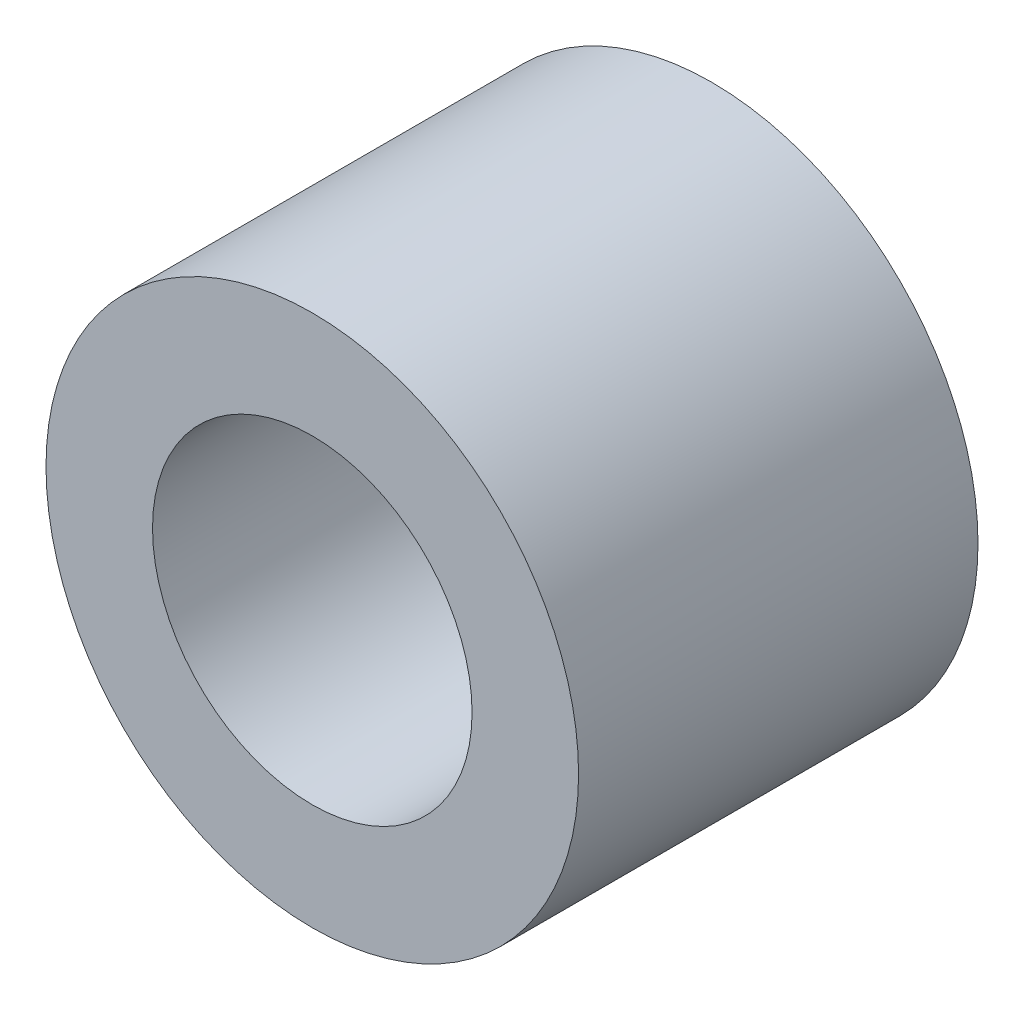
ISO-10303-21;
HEADER;
FILE_DESCRIPTION(('STEP AP214'),'2;1');
FILE_NAME('part.step','',(''),(''),'','','');
FILE_SCHEMA(('AUTOMOTIVE_DESIGN { 1 0 10303 214 1 1 1 1 }'));
ENDSEC;
DATA;
#1=APPLICATION_CONTEXT('core data for automotive mechanical design processes');
#2=APPLICATION_PROTOCOL_DEFINITION('international standard','automotive_design',2000,#1);
#3=PRODUCT_CONTEXT('',#1,'mechanical');
#4=PRODUCT('Part','Part','',(#3));
#5=PRODUCT_RELATED_PRODUCT_CATEGORY('part','',(#4));
#6=PRODUCT_DEFINITION_FORMATION('','',#4);
#7=PRODUCT_DEFINITION_CONTEXT('part definition',#1,'design');
#8=PRODUCT_DEFINITION('design','',#6,#7);
#9=PRODUCT_DEFINITION_SHAPE('','',#8);
#10=(LENGTH_UNIT() NAMED_UNIT(*) SI_UNIT(.MILLI.,.METRE.));
#11=(NAMED_UNIT(*) PLANE_ANGLE_UNIT() SI_UNIT($,.RADIAN.));
#12=(NAMED_UNIT(*) SI_UNIT($,.STERADIAN.) SOLID_ANGLE_UNIT());
#13=UNCERTAINTY_MEASURE_WITH_UNIT(LENGTH_MEASURE(1.E-05),#10,'distance_accuracy_value','');
#14=(GEOMETRIC_REPRESENTATION_CONTEXT(3) GLOBAL_UNCERTAINTY_ASSIGNED_CONTEXT((#13)) GLOBAL_UNIT_ASSIGNED_CONTEXT((#10,
#11,#12)) REPRESENTATION_CONTEXT('',''));
#15=CARTESIAN_POINT('',(0.,0.,0.));
#16=DIRECTION('',(0.,0.,1.));
#17=DIRECTION('',(1.,0.,0.));
#18=AXIS2_PLACEMENT_3D('',#15,#16,#17);
#19=CARTESIAN_POINT('',(0.,0.,3.75));
#20=DIRECTION('',(0.,0.,-1.));
#21=DIRECTION('',(-1.,0.,0.));
#22=AXIS2_PLACEMENT_3D('',#19,#20,#21);
#23=CYLINDRICAL_SURFACE('',#22,3.);
#24=CARTESIAN_POINT('',(0.,0.,3.75));
#25=DIRECTION('',(0.,0.,1.));
#26=DIRECTION('',(1.,0.,0.));
#27=AXIS2_PLACEMENT_3D('',#24,#25,#26);
#28=CIRCLE('',#27,3.);
#29=CARTESIAN_POINT('',(3.,0.,3.75));
#30=VERTEX_POINT('',#29);
#31=EDGE_CURVE('E43',#30,#30,#28,.T.);
#32=ORIENTED_EDGE('',*,*,#31,.T.);
#33=EDGE_LOOP('',(#32));
#34=FACE_BOUND('',#33,.T.);
#35=CARTESIAN_POINT('',(0.,0.,-1.875));
#36=DIRECTION('',(0.,0.,-1.));
#37=DIRECTION('',(-1.,0.,0.));
#38=AXIS2_PLACEMENT_3D('',#35,#36,#37);
#39=CIRCLE('',#38,3.);
#40=CARTESIAN_POINT('',(-3.,0.,-1.875));
#41=VERTEX_POINT('',#40);
#42=EDGE_CURVE('E47',#41,#41,#39,.T.);
#43=ORIENTED_EDGE('',*,*,#42,.T.);
#44=EDGE_LOOP('',(#43));
#45=FACE_BOUND('',#44,.T.);
#46=ADVANCED_FACE('F32',(#34,#45),#23,.F.);
#47=CARTESIAN_POINT('',(0.,0.,3.75));
#48=DIRECTION('',(0.,0.,1.));
#49=DIRECTION('',(1.,0.,0.));
#50=AXIS2_PLACEMENT_3D('',#47,#48,#49);
#51=PLANE('',#50);
#52=CARTESIAN_POINT('',(0.,0.,3.75));
#53=DIRECTION('',(0.,0.,1.));
#54=DIRECTION('',(1.,0.,0.));
#55=AXIS2_PLACEMENT_3D('',#52,#53,#54);
#56=CIRCLE('',#55,5.);
#57=CARTESIAN_POINT('',(5.,0.,3.75));
#58=VERTEX_POINT('',#57);
#59=EDGE_CURVE('E10',#58,#58,#56,.T.);
#60=ORIENTED_EDGE('',*,*,#59,.T.);
#61=EDGE_LOOP('',(#60));
#62=FACE_BOUND('',#61,.T.);
#63=ORIENTED_EDGE('',*,*,#31,.F.);
#64=EDGE_LOOP('',(#63));
#65=FACE_BOUND('',#64,.T.);
#66=ADVANCED_FACE('F62',(#62,#65),#51,.T.);
#67=CARTESIAN_POINT('',(0.,0.,-3.75));
#68=DIRECTION('',(0.,0.,1.));
#69=DIRECTION('',(1.,0.,0.));
#70=AXIS2_PLACEMENT_3D('',#67,#68,#69);
#71=PLANE('',#70);
#72=CARTESIAN_POINT('',(0.,0.,-3.75));
#73=DIRECTION('',(0.,0.,1.));
#74=DIRECTION('',(1.,0.,0.));
#75=AXIS2_PLACEMENT_3D('',#72,#73,#74);
#76=CIRCLE('',#75,5.);
#77=CARTESIAN_POINT('',(5.,0.,-3.75));
#78=VERTEX_POINT('',#77);
#79=EDGE_CURVE('E36',#78,#78,#76,.T.);
#80=ORIENTED_EDGE('',*,*,#79,.F.);
#81=EDGE_LOOP('',(#80));
#82=FACE_BOUND('',#81,.T.);
#83=ADVANCED_FACE('F58',(#82),#71,.F.);
#84=CARTESIAN_POINT('',(0.,0.,3.75));
#85=DIRECTION('',(0.,0.,-1.));
#86=DIRECTION('',(-1.,0.,0.));
#87=AXIS2_PLACEMENT_3D('',#84,#85,#86);
#88=CYLINDRICAL_SURFACE('',#87,5.);
#89=ORIENTED_EDGE('',*,*,#59,.F.);
#90=EDGE_LOOP('',(#89));
#91=FACE_BOUND('',#90,.T.);
#92=ORIENTED_EDGE('',*,*,#79,.T.);
#93=EDGE_LOOP('',(#92));
#94=FACE_BOUND('',#93,.T.);
#95=ADVANCED_FACE('F34',(#91,#94),#88,.T.);
#96=CARTESIAN_POINT('',(0.,0.,-1.875));
#97=DIRECTION('',(0.,0.,-1.));
#98=DIRECTION('',(-1.,0.,0.));
#99=AXIS2_PLACEMENT_3D('',#96,#97,#98);
#100=PLANE('',#99);
#101=ORIENTED_EDGE('',*,*,#42,.F.);
#102=EDGE_LOOP('',(#101));
#103=FACE_BOUND('',#102,.T.);
#104=ADVANCED_FACE('F52',(#103),#100,.F.);
#105=CLOSED_SHELL('',(#46,#66,#83,#95,#104));
#106=MANIFOLD_SOLID_BREP('B2',#105);
#107=ADVANCED_BREP_SHAPE_REPRESENTATION('',(#18,#106),#14);
#108=SHAPE_DEFINITION_REPRESENTATION(#9,#107);
ENDSEC;
END-ISO-10303-21;
